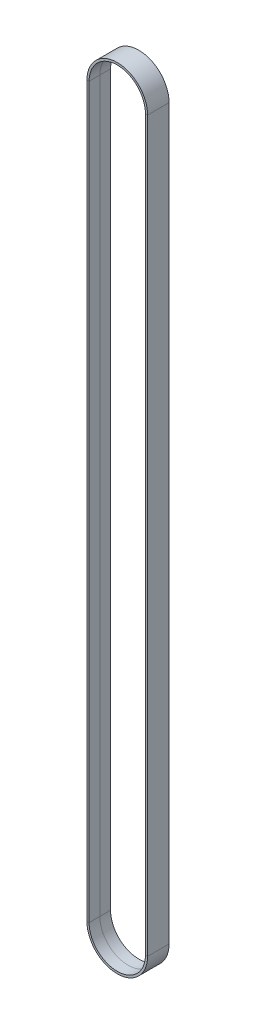
ISO-10303-21;
HEADER;
FILE_DESCRIPTION(('STEP AP214'),'2;1');
FILE_NAME('part.step','',(''),(''),'','','');
FILE_SCHEMA(('AUTOMOTIVE_DESIGN { 1 0 10303 214 1 1 1 1 }'));
ENDSEC;
DATA;
#1=APPLICATION_CONTEXT('core data for automotive mechanical design processes');
#2=APPLICATION_PROTOCOL_DEFINITION('international standard','automotive_design',2000,#1);
#3=PRODUCT_CONTEXT('',#1,'mechanical');
#4=PRODUCT('Part','Part','',(#3));
#5=PRODUCT_RELATED_PRODUCT_CATEGORY('part','',(#4));
#6=PRODUCT_DEFINITION_FORMATION('','',#4);
#7=PRODUCT_DEFINITION_CONTEXT('part definition',#1,'design');
#8=PRODUCT_DEFINITION('design','',#6,#7);
#9=PRODUCT_DEFINITION_SHAPE('','',#8);
#10=(LENGTH_UNIT() NAMED_UNIT(*) SI_UNIT(.MILLI.,.METRE.));
#11=(NAMED_UNIT(*) PLANE_ANGLE_UNIT() SI_UNIT($,.RADIAN.));
#12=(NAMED_UNIT(*) SI_UNIT($,.STERADIAN.) SOLID_ANGLE_UNIT());
#13=UNCERTAINTY_MEASURE_WITH_UNIT(LENGTH_MEASURE(1.E-05),#10,'distance_accuracy_value','');
#14=(GEOMETRIC_REPRESENTATION_CONTEXT(3) GLOBAL_UNCERTAINTY_ASSIGNED_CONTEXT((#13)) GLOBAL_UNIT_ASSIGNED_CONTEXT((#10,
#11,#12)) REPRESENTATION_CONTEXT('',''));
#15=CARTESIAN_POINT('',(0.,0.,0.));
#16=DIRECTION('',(0.,0.,1.));
#17=DIRECTION('',(1.,0.,0.));
#18=AXIS2_PLACEMENT_3D('',#15,#16,#17);
#19=CARTESIAN_POINT('',(26.2499999999824,0.,-9.99999999999977));
#20=DIRECTION('',(0.,0.,1.));
#21=DIRECTION('',(1.,0.,0.));
#22=AXIS2_PLACEMENT_3D('',#19,#20,#21);
#23=PLANE('',#22);
#24=DIRECTION('',(1.,0.,0.));
#25=VECTOR('',#24,1.);
#26=CARTESIAN_POINT('',(26.2499999999824,0.,-9.99999999999977));
#27=LINE('',#26,#25);
#28=CARTESIAN_POINT('',(26.2500000000175,0.,-9.99999999999977));
#29=VERTEX_POINT('',#28);
#30=CARTESIAN_POINT('',(28.2500000000175,0.,-9.99999999999977));
#31=VERTEX_POINT('',#30);
#32=EDGE_CURVE('E168',#29,#31,#27,.T.);
#33=ORIENTED_EDGE('',*,*,#32,.F.);
#34=CARTESIAN_POINT('',(1.75415237890775E-11,-2.4757973449141E-11,-9.99999999999977));
#35=DIRECTION('',(0.,0.,1.));
#36=DIRECTION('',(1.,9.43283357981785E-13,0.));
#37=AXIS2_PLACEMENT_3D('',#34,#35,#36);
#38=CIRCLE('',#37,26.2499999999649);
#39=CARTESIAN_POINT('',(-26.2499999999824,0.,-9.99999999999977));
#40=VERTEX_POINT('',#39);
#41=EDGE_CURVE('E167',#29,#40,#38,.T.);
#42=ORIENTED_EDGE('',*,*,#41,.T.);
#43=DIRECTION('',(-1.,0.,0.));
#44=VECTOR('',#43,1.);
#45=CARTESIAN_POINT('',(-26.2499999999824,0.,-9.99999999999977));
#46=LINE('',#45,#44);
#47=CARTESIAN_POINT('',(-28.2499999999824,0.,-9.99999999999977));
#48=VERTEX_POINT('',#47);
#49=EDGE_CURVE('E147',#40,#48,#46,.T.);
#50=ORIENTED_EDGE('',*,*,#49,.T.);
#51=CARTESIAN_POINT('',(1.75415237890775E-11,-2.4757973449141E-11,-9.99999999999977));
#52=DIRECTION('',(0.,0.,1.));
#53=DIRECTION('',(1.,8.76510905358561E-13,0.));
#54=AXIS2_PLACEMENT_3D('',#51,#52,#53);
#55=CIRCLE('',#54,28.2499999999649);
#56=EDGE_CURVE('E172',#31,#48,#55,.T.);
#57=ORIENTED_EDGE('',*,*,#56,.F.);
#58=EDGE_LOOP('',(#33,#42,#50,#57));
#59=FACE_BOUND('',#58,.T.);
#60=ADVANCED_FACE('F35',(#59),#23,.F.);
#61=CARTESIAN_POINT('',(-26.2499999999824,0.,-9.99999999999977));
#62=DIRECTION('',(0.,0.,1.));
#63=DIRECTION('',(1.,0.,0.));
#64=AXIS2_PLACEMENT_3D('',#61,#62,#63);
#65=PLANE('',#64);
#66=DIRECTION('',(0.,-1.,0.));
#67=VECTOR('',#66,1.);
#68=CARTESIAN_POINT('',(-28.2499999999824,0.,-9.99999999999977));
#69=LINE('',#68,#67);
#70=CARTESIAN_POINT('',(-28.2499999999824,-678.678709754634,-9.99999999999977));
#71=VERTEX_POINT('',#70);
#72=EDGE_CURVE('E130',#48,#71,#69,.T.);
#73=ORIENTED_EDGE('',*,*,#72,.F.);
#74=ORIENTED_EDGE('',*,*,#49,.F.);
#75=DIRECTION('',(0.,-1.,0.));
#76=VECTOR('',#75,1.);
#77=CARTESIAN_POINT('',(-26.2499999999824,0.,-9.99999999999977));
#78=LINE('',#77,#76);
#79=CARTESIAN_POINT('',(-26.2499999999824,-678.678709754634,-9.99999999999977));
#80=VERTEX_POINT('',#79);
#81=EDGE_CURVE('E152',#40,#80,#78,.T.);
#82=ORIENTED_EDGE('',*,*,#81,.T.);
#83=DIRECTION('',(-1.,0.,0.));
#84=VECTOR('',#83,1.);
#85=CARTESIAN_POINT('',(-26.2499999999824,-678.678709754634,-9.99999999999977));
#86=LINE('',#85,#84);
#87=EDGE_CURVE('E164',#80,#71,#86,.T.);
#88=ORIENTED_EDGE('',*,*,#87,.T.);
#89=EDGE_LOOP('',(#73,#74,#82,#88));
#90=FACE_BOUND('',#89,.T.);
#91=ADVANCED_FACE('F151',(#90),#65,.F.);
#92=CARTESIAN_POINT('',(-28.2499999999824,0.,-9.99999999999977));
#93=DIRECTION('',(1.,0.,0.));
#94=DIRECTION('',(0.,0.,-1.));
#95=AXIS2_PLACEMENT_3D('',#92,#93,#94);
#96=PLANE('',#95);
#97=DIRECTION('',(0.,-1.,0.));
#98=VECTOR('',#97,1.);
#99=CARTESIAN_POINT('',(-28.2499999999824,0.,10.0000000000002));
#100=LINE('',#99,#98);
#101=CARTESIAN_POINT('',(-28.2499999999824,0.,10.0000000000002));
#102=VERTEX_POINT('',#101);
#103=CARTESIAN_POINT('',(-28.2499999999824,-678.678709754634,10.0000000000002));
#104=VERTEX_POINT('',#103);
#105=EDGE_CURVE('E123',#102,#104,#100,.T.);
#106=ORIENTED_EDGE('',*,*,#105,.F.);
#107=DIRECTION('',(0.,0.,1.));
#108=VECTOR('',#107,1.);
#109=CARTESIAN_POINT('',(-28.2499999999824,0.,-9.99999999999977));
#110=LINE('',#109,#108);
#111=EDGE_CURVE('E154',#48,#102,#110,.T.);
#112=ORIENTED_EDGE('',*,*,#111,.F.);
#113=ORIENTED_EDGE('',*,*,#72,.T.);
#114=DIRECTION('',(0.,0.,1.));
#115=VECTOR('',#114,1.);
#116=CARTESIAN_POINT('',(-28.2499999999824,-678.678709754634,-9.99999999999977));
#117=LINE('',#116,#115);
#118=EDGE_CURVE('E230',#71,#104,#117,.T.);
#119=ORIENTED_EDGE('',*,*,#118,.T.);
#120=EDGE_LOOP('',(#106,#112,#113,#119));
#121=FACE_BOUND('',#120,.T.);
#122=ADVANCED_FACE('F252',(#121),#96,.F.);
#123=CARTESIAN_POINT('',(-26.2499999999824,0.,10.0000000000002));
#124=DIRECTION('',(0.,0.,-1.));
#125=DIRECTION('',(-1.,0.,0.));
#126=AXIS2_PLACEMENT_3D('',#123,#124,#125);
#127=PLANE('',#126);
#128=DIRECTION('',(0.,-1.,0.));
#129=VECTOR('',#128,1.);
#130=CARTESIAN_POINT('',(-26.2499999999824,0.,10.0000000000002));
#131=LINE('',#130,#129);
#132=CARTESIAN_POINT('',(-26.2499999999824,0.,10.0000000000002));
#133=VERTEX_POINT('',#132);
#134=CARTESIAN_POINT('',(-26.2499999999824,-678.678709754634,10.0000000000002));
#135=VERTEX_POINT('',#134);
#136=EDGE_CURVE('E116',#133,#135,#131,.T.);
#137=ORIENTED_EDGE('',*,*,#136,.F.);
#138=DIRECTION('',(1.,0.,0.));
#139=VECTOR('',#138,1.);
#140=CARTESIAN_POINT('',(-26.2499999999824,0.,10.0000000000002));
#141=LINE('',#140,#139);
#142=EDGE_CURVE('E178',#102,#133,#141,.T.);
#143=ORIENTED_EDGE('',*,*,#142,.F.);
#144=ORIENTED_EDGE('',*,*,#105,.T.);
#145=DIRECTION('',(1.,0.,0.));
#146=VECTOR('',#145,1.);
#147=CARTESIAN_POINT('',(-26.2499999999824,-678.678709754634,10.0000000000002));
#148=LINE('',#147,#146);
#149=EDGE_CURVE('E214',#104,#135,#148,.T.);
#150=ORIENTED_EDGE('',*,*,#149,.T.);
#151=EDGE_LOOP('',(#137,#143,#144,#150));
#152=FACE_BOUND('',#151,.T.);
#153=ADVANCED_FACE('F254',(#152),#127,.F.);
#154=CARTESIAN_POINT('',(-26.2499999999824,0.,0.));
#155=DIRECTION('',(-1.,0.,0.));
#156=DIRECTION('',(0.,0.,1.));
#157=AXIS2_PLACEMENT_3D('',#154,#155,#156);
#158=PLANE('',#157);
#159=DIRECTION('',(0.,-1.,0.));
#160=VECTOR('',#159,1.);
#161=CARTESIAN_POINT('',(-26.2499999999824,0.,0.));
#162=LINE('',#161,#160);
#163=CARTESIAN_POINT('',(-26.2499999999824,0.,0.));
#164=VERTEX_POINT('',#163);
#165=CARTESIAN_POINT('',(-26.2499999999824,-678.678709754634,0.));
#166=VERTEX_POINT('',#165);
#167=EDGE_CURVE('E183',#164,#166,#162,.T.);
#168=ORIENTED_EDGE('',*,*,#167,.F.);
#169=DIRECTION('',(0.,0.,-1.));
#170=VECTOR('',#169,1.);
#171=CARTESIAN_POINT('',(-26.2499999999824,0.,0.));
#172=LINE('',#171,#170);
#173=EDGE_CURVE('E175',#133,#164,#172,.T.);
#174=ORIENTED_EDGE('',*,*,#173,.F.);
#175=ORIENTED_EDGE('',*,*,#136,.T.);
#176=DIRECTION('',(0.,0.,-1.));
#177=VECTOR('',#176,1.);
#178=CARTESIAN_POINT('',(-26.2499999999824,-678.678709754634,0.));
#179=LINE('',#178,#177);
#180=EDGE_CURVE('E201',#135,#166,#179,.T.);
#181=ORIENTED_EDGE('',*,*,#180,.T.);
#182=EDGE_LOOP('',(#168,#174,#175,#181));
#183=FACE_BOUND('',#182,.T.);
#184=ADVANCED_FACE('F200',(#183),#158,.F.);
#185=CARTESIAN_POINT('',(-26.2499999999824,0.,0.));
#186=DIRECTION('',(-1.,0.,0.));
#187=DIRECTION('',(0.,0.,1.));
#188=AXIS2_PLACEMENT_3D('',#185,#186,#187);
#189=PLANE('',#188);
#190=DIRECTION('',(0.,0.,-1.));
#191=VECTOR('',#190,1.);
#192=CARTESIAN_POINT('',(-26.2499999999824,-678.678709754634,0.));
#193=LINE('',#192,#191);
#194=EDGE_CURVE('E162',#166,#80,#193,.T.);
#195=ORIENTED_EDGE('',*,*,#194,.T.);
#196=ORIENTED_EDGE('',*,*,#81,.F.);
#197=DIRECTION('',(0.,0.,-1.));
#198=VECTOR('',#197,1.);
#199=CARTESIAN_POINT('',(-26.2499999999824,0.,0.));
#200=LINE('',#199,#198);
#201=EDGE_CURVE('E161',#164,#40,#200,.T.);
#202=ORIENTED_EDGE('',*,*,#201,.F.);
#203=ORIENTED_EDGE('',*,*,#167,.T.);
#204=EDGE_LOOP('',(#195,#196,#202,#203));
#205=FACE_BOUND('',#204,.T.);
#206=ADVANCED_FACE('F159',(#205),#189,.F.);
#207=CARTESIAN_POINT('',(-26.2499999999824,-678.678709754634,-9.99999999999977));
#208=DIRECTION('',(0.,0.,1.));
#209=DIRECTION('',(1.,0.,0.));
#210=AXIS2_PLACEMENT_3D('',#207,#208,#209);
#211=PLANE('',#210);
#212=CARTESIAN_POINT('',(1.75415237890775E-11,-678.678709754659,-9.99999999999977));
#213=DIRECTION('',(0.,0.,1.));
#214=DIRECTION('',(-1.,8.76388440677558E-13,0.));
#215=AXIS2_PLACEMENT_3D('',#212,#213,#214);
#216=CIRCLE('',#215,28.25);
#217=CARTESIAN_POINT('',(28.2500000000175,-678.678709754684,-9.99999999999977));
#218=VERTEX_POINT('',#217);
#219=EDGE_CURVE('E228',#71,#218,#216,.T.);
#220=ORIENTED_EDGE('',*,*,#219,.F.);
#221=ORIENTED_EDGE('',*,*,#87,.F.);
#222=CARTESIAN_POINT('',(1.75415237890775E-11,-678.678709754659,-9.99999999999977));
#223=DIRECTION('',(0.,0.,1.));
#224=DIRECTION('',(-1.,9.4316089330061E-13,0.));
#225=AXIS2_PLACEMENT_3D('',#222,#223,#224);
#226=CIRCLE('',#225,26.25);
#227=CARTESIAN_POINT('',(26.2500000000175,-678.678709754684,-9.99999999999977));
#228=VERTEX_POINT('',#227);
#229=EDGE_CURVE('E182',#80,#228,#226,.T.);
#230=ORIENTED_EDGE('',*,*,#229,.T.);
#231=DIRECTION('',(1.,0.,0.));
#232=VECTOR('',#231,1.);
#233=CARTESIAN_POINT('',(26.2500000000175,-678.678709754684,-9.99999999999977));
#234=LINE('',#233,#232);
#235=EDGE_CURVE('E239',#228,#218,#234,.T.);
#236=ORIENTED_EDGE('',*,*,#235,.T.);
#237=EDGE_LOOP('',(#220,#221,#230,#236));
#238=FACE_BOUND('',#237,.T.);
#239=ADVANCED_FACE('F247',(#238),#211,.F.);
#240=CARTESIAN_POINT('',(1.75415237890775E-11,-678.678709754659,0.));
#241=DIRECTION('',(0.,0.,1.));
#242=DIRECTION('',(1.,0.,0.));
#243=AXIS2_PLACEMENT_3D('',#240,#241,#242);
#244=CYLINDRICAL_SURFACE('',#243,28.25);
#245=CARTESIAN_POINT('',(1.75415237890775E-11,-678.678709754659,10.0000000000002));
#246=DIRECTION('',(0.,0.,1.));
#247=DIRECTION('',(-1.,8.76388440677558E-13,0.));
#248=AXIS2_PLACEMENT_3D('',#245,#246,#247);
#249=CIRCLE('',#248,28.25);
#250=CARTESIAN_POINT('',(28.2500000000175,-678.678709754684,10.0000000000002));
#251=VERTEX_POINT('',#250);
#252=EDGE_CURVE('E102',#104,#251,#249,.T.);
#253=ORIENTED_EDGE('',*,*,#252,.F.);
#254=ORIENTED_EDGE('',*,*,#118,.F.);
#255=ORIENTED_EDGE('',*,*,#219,.T.);
#256=DIRECTION('',(0.,0.,1.));
#257=VECTOR('',#256,1.);
#258=CARTESIAN_POINT('',(28.2500000000175,-678.678709754684,-9.99999999999977));
#259=LINE('',#258,#257);
#260=EDGE_CURVE('E226',#218,#251,#259,.T.);
#261=ORIENTED_EDGE('',*,*,#260,.T.);
#262=EDGE_LOOP('',(#253,#254,#255,#261));
#263=FACE_BOUND('',#262,.T.);
#264=ADVANCED_FACE('F251',(#263),#244,.T.);
#265=CARTESIAN_POINT('',(-26.2499999999824,-678.678709754634,10.0000000000002));
#266=DIRECTION('',(0.,0.,-1.));
#267=DIRECTION('',(-1.,0.,0.));
#268=AXIS2_PLACEMENT_3D('',#265,#266,#267);
#269=PLANE('',#268);
#270=CARTESIAN_POINT('',(1.75415237890775E-11,-678.678709754659,10.0000000000002));
#271=DIRECTION('',(0.,0.,1.));
#272=DIRECTION('',(-1.,9.4316089330061E-13,0.));
#273=AXIS2_PLACEMENT_3D('',#270,#271,#272);
#274=CIRCLE('',#273,26.25);
#275=CARTESIAN_POINT('',(26.2500000000175,-678.678709754684,10.0000000000002));
#276=VERTEX_POINT('',#275);
#277=EDGE_CURVE('E94',#135,#276,#274,.T.);
#278=ORIENTED_EDGE('',*,*,#277,.F.);
#279=ORIENTED_EDGE('',*,*,#149,.F.);
#280=ORIENTED_EDGE('',*,*,#252,.T.);
#281=DIRECTION('',(-1.,0.,0.));
#282=VECTOR('',#281,1.);
#283=CARTESIAN_POINT('',(26.2500000000175,-678.678709754684,10.0000000000002));
#284=LINE('',#283,#282);
#285=EDGE_CURVE('E211',#251,#276,#284,.T.);
#286=ORIENTED_EDGE('',*,*,#285,.T.);
#287=EDGE_LOOP('',(#278,#279,#280,#286));
#288=FACE_BOUND('',#287,.T.);
#289=ADVANCED_FACE('F279',(#288),#269,.F.);
#290=CARTESIAN_POINT('',(1.75415237890775E-11,-678.678709754659,0.));
#291=DIRECTION('',(0.,0.,1.));
#292=DIRECTION('',(1.,0.,0.));
#293=AXIS2_PLACEMENT_3D('',#290,#291,#292);
#294=CYLINDRICAL_SURFACE('',#293,26.25);
#295=CARTESIAN_POINT('',(1.75415237890775E-11,-678.678709754659,0.));
#296=DIRECTION('',(0.,0.,1.));
#297=DIRECTION('',(-1.,9.4316089330061E-13,0.));
#298=AXIS2_PLACEMENT_3D('',#295,#296,#297);
#299=CIRCLE('',#298,26.25);
#300=CARTESIAN_POINT('',(26.2500000000175,-678.678709754684,0.));
#301=VERTEX_POINT('',#300);
#302=EDGE_CURVE('E85',#166,#301,#299,.T.);
#303=ORIENTED_EDGE('',*,*,#302,.F.);
#304=ORIENTED_EDGE('',*,*,#180,.F.);
#305=ORIENTED_EDGE('',*,*,#277,.T.);
#306=DIRECTION('',(0.,0.,-1.));
#307=VECTOR('',#306,1.);
#308=CARTESIAN_POINT('',(26.2500000000175,-678.678709754684,0.));
#309=LINE('',#308,#307);
#310=EDGE_CURVE('E188',#276,#301,#309,.T.);
#311=ORIENTED_EDGE('',*,*,#310,.T.);
#312=EDGE_LOOP('',(#303,#304,#305,#311));
#313=FACE_BOUND('',#312,.T.);
#314=ADVANCED_FACE('F289',(#313),#294,.F.);
#315=CARTESIAN_POINT('',(1.75415237890775E-11,-678.678709754659,0.));
#316=DIRECTION('',(0.,0.,1.));
#317=DIRECTION('',(1.,0.,0.));
#318=AXIS2_PLACEMENT_3D('',#315,#316,#317);
#319=CYLINDRICAL_SURFACE('',#318,26.25);
#320=DIRECTION('',(0.,0.,-1.));
#321=VECTOR('',#320,1.);
#322=CARTESIAN_POINT('',(26.2500000000175,-678.678709754684,0.));
#323=LINE('',#322,#321);
#324=EDGE_CURVE('E184',#301,#228,#323,.T.);
#325=ORIENTED_EDGE('',*,*,#324,.T.);
#326=ORIENTED_EDGE('',*,*,#229,.F.);
#327=ORIENTED_EDGE('',*,*,#194,.F.);
#328=ORIENTED_EDGE('',*,*,#302,.T.);
#329=EDGE_LOOP('',(#325,#326,#327,#328));
#330=FACE_BOUND('',#329,.T.);
#331=ADVANCED_FACE('F272',(#330),#319,.F.);
#332=CARTESIAN_POINT('',(26.2500000000175,-678.678709754684,-9.99999999999977));
#333=DIRECTION('',(0.,0.,1.));
#334=DIRECTION('',(1.,0.,0.));
#335=AXIS2_PLACEMENT_3D('',#332,#333,#334);
#336=PLANE('',#335);
#337=DIRECTION('',(0.,1.,0.));
#338=VECTOR('',#337,1.);
#339=CARTESIAN_POINT('',(28.2500000000175,-678.678709754684,-9.99999999999977));
#340=LINE('',#339,#338);
#341=EDGE_CURVE('E224',#218,#31,#340,.T.);
#342=ORIENTED_EDGE('',*,*,#341,.F.);
#343=ORIENTED_EDGE('',*,*,#235,.F.);
#344=DIRECTION('',(0.,1.,0.));
#345=VECTOR('',#344,1.);
#346=CARTESIAN_POINT('',(26.2500000000175,-678.678709754684,-9.99999999999977));
#347=LINE('',#346,#345);
#348=EDGE_CURVE('E185',#228,#29,#347,.T.);
#349=ORIENTED_EDGE('',*,*,#348,.T.);
#350=ORIENTED_EDGE('',*,*,#32,.T.);
#351=EDGE_LOOP('',(#342,#343,#349,#350));
#352=FACE_BOUND('',#351,.T.);
#353=ADVANCED_FACE('F268',(#352),#336,.F.);
#354=CARTESIAN_POINT('',(28.2500000000175,-678.678709754684,-9.99999999999977));
#355=DIRECTION('',(-1.,0.,0.));
#356=DIRECTION('',(0.,0.,1.));
#357=AXIS2_PLACEMENT_3D('',#354,#355,#356);
#358=PLANE('',#357);
#359=DIRECTION('',(0.,1.,0.));
#360=VECTOR('',#359,1.);
#361=CARTESIAN_POINT('',(28.2500000000175,-678.678709754684,10.0000000000002));
#362=LINE('',#361,#360);
#363=CARTESIAN_POINT('',(28.2500000000175,0.,10.0000000000002));
#364=VERTEX_POINT('',#363);
#365=EDGE_CURVE('E209',#251,#364,#362,.T.);
#366=ORIENTED_EDGE('',*,*,#365,.F.);
#367=ORIENTED_EDGE('',*,*,#260,.F.);
#368=ORIENTED_EDGE('',*,*,#341,.T.);
#369=DIRECTION('',(0.,0.,1.));
#370=VECTOR('',#369,1.);
#371=CARTESIAN_POINT('',(28.2499999999824,0.,-9.99999999999977));
#372=LINE('',#371,#370);
#373=EDGE_CURVE('E221',#31,#364,#372,.T.);
#374=ORIENTED_EDGE('',*,*,#373,.T.);
#375=EDGE_LOOP('',(#366,#367,#368,#374));
#376=FACE_BOUND('',#375,.T.);
#377=ADVANCED_FACE('F271',(#376),#358,.F.);
#378=CARTESIAN_POINT('',(26.2500000000175,-678.678709754684,10.0000000000002));
#379=DIRECTION('',(0.,0.,-1.));
#380=DIRECTION('',(-1.,0.,0.));
#381=AXIS2_PLACEMENT_3D('',#378,#379,#380);
#382=PLANE('',#381);
#383=DIRECTION('',(0.,1.,0.));
#384=VECTOR('',#383,1.);
#385=CARTESIAN_POINT('',(26.2500000000175,-678.678709754684,10.0000000000002));
#386=LINE('',#385,#384);
#387=CARTESIAN_POINT('',(26.2500000000175,0.,10.0000000000002));
#388=VERTEX_POINT('',#387);
#389=EDGE_CURVE('E60',#276,#388,#386,.T.);
#390=ORIENTED_EDGE('',*,*,#389,.F.);
#391=ORIENTED_EDGE('',*,*,#285,.F.);
#392=ORIENTED_EDGE('',*,*,#365,.T.);
#393=DIRECTION('',(-1.,0.,0.));
#394=VECTOR('',#393,1.);
#395=CARTESIAN_POINT('',(26.2499999999824,0.,10.0000000000002));
#396=LINE('',#395,#394);
#397=EDGE_CURVE('E207',#364,#388,#396,.T.);
#398=ORIENTED_EDGE('',*,*,#397,.T.);
#399=EDGE_LOOP('',(#390,#391,#392,#398));
#400=FACE_BOUND('',#399,.T.);
#401=ADVANCED_FACE('F300',(#400),#382,.F.);
#402=CARTESIAN_POINT('',(26.2500000000175,-678.678709754684,0.));
#403=DIRECTION('',(1.,0.,0.));
#404=DIRECTION('',(0.,0.,-1.));
#405=AXIS2_PLACEMENT_3D('',#402,#403,#404);
#406=PLANE('',#405);
#407=DIRECTION('',(0.,1.,0.));
#408=VECTOR('',#407,1.);
#409=CARTESIAN_POINT('',(26.2500000000175,-678.678709754684,0.));
#410=LINE('',#409,#408);
#411=CARTESIAN_POINT('',(26.2500000000175,0.,0.));
#412=VERTEX_POINT('',#411);
#413=EDGE_CURVE('E52',#301,#412,#410,.T.);
#414=ORIENTED_EDGE('',*,*,#413,.F.);
#415=ORIENTED_EDGE('',*,*,#310,.F.);
#416=ORIENTED_EDGE('',*,*,#389,.T.);
#417=DIRECTION('',(0.,0.,-1.));
#418=VECTOR('',#417,1.);
#419=CARTESIAN_POINT('',(26.2499999999824,0.,0.));
#420=LINE('',#419,#418);
#421=EDGE_CURVE('E193',#388,#412,#420,.T.);
#422=ORIENTED_EDGE('',*,*,#421,.T.);
#423=EDGE_LOOP('',(#414,#415,#416,#422));
#424=FACE_BOUND('',#423,.T.);
#425=ADVANCED_FACE('F292',(#424),#406,.F.);
#426=CARTESIAN_POINT('',(26.2500000000175,-678.678709754684,0.));
#427=DIRECTION('',(1.,0.,0.));
#428=DIRECTION('',(0.,0.,-1.));
#429=AXIS2_PLACEMENT_3D('',#426,#427,#428);
#430=PLANE('',#429);
#431=DIRECTION('',(0.,0.,-1.));
#432=VECTOR('',#431,1.);
#433=CARTESIAN_POINT('',(26.2499999999824,0.,0.));
#434=LINE('',#433,#432);
#435=EDGE_CURVE('E39',#412,#29,#434,.T.);
#436=ORIENTED_EDGE('',*,*,#435,.T.);
#437=ORIENTED_EDGE('',*,*,#348,.F.);
#438=ORIENTED_EDGE('',*,*,#324,.F.);
#439=ORIENTED_EDGE('',*,*,#413,.T.);
#440=EDGE_LOOP('',(#436,#437,#438,#439));
#441=FACE_BOUND('',#440,.T.);
#442=ADVANCED_FACE('F194',(#441),#430,.F.);
#443=CARTESIAN_POINT('',(1.75415237890775E-11,-2.4757973449141E-11,0.));
#444=DIRECTION('',(0.,0.,1.));
#445=DIRECTION('',(1.,0.,0.));
#446=AXIS2_PLACEMENT_3D('',#443,#444,#445);
#447=CYLINDRICAL_SURFACE('',#446,28.2499999999649);
#448=ORIENTED_EDGE('',*,*,#56,.T.);
#449=ORIENTED_EDGE('',*,*,#111,.T.);
#450=CARTESIAN_POINT('',(1.75415237890775E-11,-2.4757973449141E-11,10.0000000000002));
#451=DIRECTION('',(0.,0.,1.));
#452=DIRECTION('',(1.,8.76510905358561E-13,0.));
#453=AXIS2_PLACEMENT_3D('',#450,#451,#452);
#454=CIRCLE('',#453,28.2499999999649);
#455=EDGE_CURVE('E205',#364,#102,#454,.T.);
#456=ORIENTED_EDGE('',*,*,#455,.F.);
#457=ORIENTED_EDGE('',*,*,#373,.F.);
#458=EDGE_LOOP('',(#448,#449,#456,#457));
#459=FACE_BOUND('',#458,.T.);
#460=ADVANCED_FACE('F291',(#459),#447,.T.);
#461=CARTESIAN_POINT('',(26.2499999999824,0.,10.0000000000002));
#462=DIRECTION('',(0.,0.,-1.));
#463=DIRECTION('',(-1.,0.,0.));
#464=AXIS2_PLACEMENT_3D('',#461,#462,#463);
#465=PLANE('',#464);
#466=ORIENTED_EDGE('',*,*,#455,.T.);
#467=ORIENTED_EDGE('',*,*,#142,.T.);
#468=CARTESIAN_POINT('',(1.75415237890775E-11,-2.4757973449141E-11,10.0000000000002));
#469=DIRECTION('',(0.,0.,1.));
#470=DIRECTION('',(1.,9.43283357981785E-13,0.));
#471=AXIS2_PLACEMENT_3D('',#468,#469,#470);
#472=CIRCLE('',#471,26.2499999999649);
#473=EDGE_CURVE('E44',#388,#133,#472,.T.);
#474=ORIENTED_EDGE('',*,*,#473,.F.);
#475=ORIENTED_EDGE('',*,*,#397,.F.);
#476=EDGE_LOOP('',(#466,#467,#474,#475));
#477=FACE_BOUND('',#476,.T.);
#478=ADVANCED_FACE('F297',(#477),#465,.F.);
#479=CARTESIAN_POINT('',(1.75415237890775E-11,-2.4757973449141E-11,0.));
#480=DIRECTION('',(0.,0.,1.));
#481=DIRECTION('',(1.,0.,0.));
#482=AXIS2_PLACEMENT_3D('',#479,#480,#481);
#483=CYLINDRICAL_SURFACE('',#482,26.2499999999649);
#484=ORIENTED_EDGE('',*,*,#473,.T.);
#485=ORIENTED_EDGE('',*,*,#173,.T.);
#486=CARTESIAN_POINT('',(1.75415237890775E-11,-2.4757973449141E-11,0.));
#487=DIRECTION('',(0.,0.,1.));
#488=DIRECTION('',(1.,9.43283357981785E-13,0.));
#489=AXIS2_PLACEMENT_3D('',#486,#487,#488);
#490=CIRCLE('',#489,26.2499999999649);
#491=EDGE_CURVE('E11',#412,#164,#490,.T.);
#492=ORIENTED_EDGE('',*,*,#491,.F.);
#493=ORIENTED_EDGE('',*,*,#421,.F.);
#494=EDGE_LOOP('',(#484,#485,#492,#493));
#495=FACE_BOUND('',#494,.T.);
#496=ADVANCED_FACE('F198',(#495),#483,.F.);
#497=CARTESIAN_POINT('',(1.75415237890775E-11,-2.4757973449141E-11,0.));
#498=DIRECTION('',(0.,0.,1.));
#499=DIRECTION('',(1.,0.,0.));
#500=AXIS2_PLACEMENT_3D('',#497,#498,#499);
#501=CYLINDRICAL_SURFACE('',#500,26.2499999999649);
#502=ORIENTED_EDGE('',*,*,#491,.T.);
#503=ORIENTED_EDGE('',*,*,#201,.T.);
#504=ORIENTED_EDGE('',*,*,#41,.F.);
#505=ORIENTED_EDGE('',*,*,#435,.F.);
#506=EDGE_LOOP('',(#502,#503,#504,#505));
#507=FACE_BOUND('',#506,.T.);
#508=ADVANCED_FACE('F37',(#507),#501,.F.);
#509=CLOSED_SHELL('',(#60,#91,#122,#153,#184,#206,#239,#264,#289,#314,#331,#353,#377,#401,#425,
#442,#460,#478,#496,#508));
#510=MANIFOLD_SOLID_BREP('B2',#509);
#511=ADVANCED_BREP_SHAPE_REPRESENTATION('',(#18,#510),#14);
#512=SHAPE_DEFINITION_REPRESENTATION(#9,#511);
ENDSEC;
END-ISO-10303-21;
